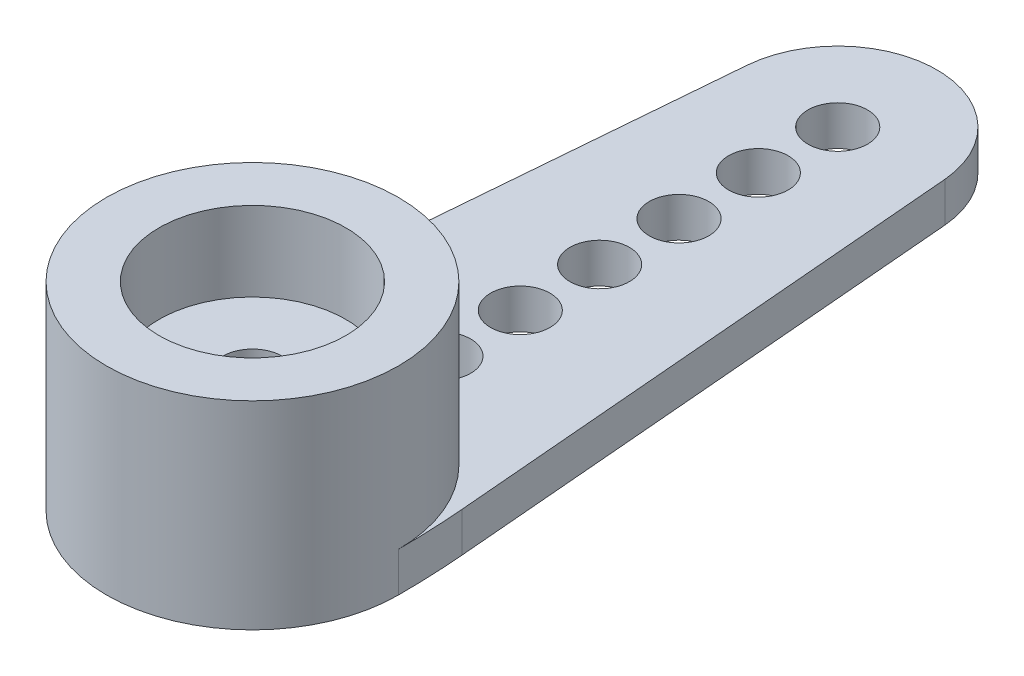
ISO-10303-21;
HEADER;
FILE_DESCRIPTION(('STEP AP214'),'2;1');
FILE_NAME('part.step','',(''),(''),'','','');
FILE_SCHEMA(('AUTOMOTIVE_DESIGN { 1 0 10303 214 1 1 1 1 }'));
ENDSEC;
DATA;
#1=APPLICATION_CONTEXT('core data for automotive mechanical design processes');
#2=APPLICATION_PROTOCOL_DEFINITION('international standard','automotive_design',2000,#1);
#3=PRODUCT_CONTEXT('',#1,'mechanical');
#4=PRODUCT('Part','Part','',(#3));
#5=PRODUCT_RELATED_PRODUCT_CATEGORY('part','',(#4));
#6=PRODUCT_DEFINITION_FORMATION('','',#4);
#7=PRODUCT_DEFINITION_CONTEXT('part definition',#1,'design');
#8=PRODUCT_DEFINITION('design','',#6,#7);
#9=PRODUCT_DEFINITION_SHAPE('','',#8);
#10=(LENGTH_UNIT() NAMED_UNIT(*) SI_UNIT(.MILLI.,.METRE.));
#11=(NAMED_UNIT(*) PLANE_ANGLE_UNIT() SI_UNIT($,.RADIAN.));
#12=(NAMED_UNIT(*) SI_UNIT($,.STERADIAN.) SOLID_ANGLE_UNIT());
#13=UNCERTAINTY_MEASURE_WITH_UNIT(LENGTH_MEASURE(1.E-05),#10,'distance_accuracy_value','');
#14=(GEOMETRIC_REPRESENTATION_CONTEXT(3) GLOBAL_UNCERTAINTY_ASSIGNED_CONTEXT((#13)) GLOBAL_UNIT_ASSIGNED_CONTEXT((#10,
#11,#12)) REPRESENTATION_CONTEXT('',''));
#15=CARTESIAN_POINT('',(0.,0.,0.));
#16=DIRECTION('',(0.,0.,1.));
#17=DIRECTION('',(1.,0.,0.));
#18=AXIS2_PLACEMENT_3D('',#15,#16,#17);
#19=CARTESIAN_POINT('',(0.,5.,0.));
#20=DIRECTION('',(0.,-1.,0.));
#21=DIRECTION('',(0.,0.,-1.));
#22=AXIS2_PLACEMENT_3D('',#19,#20,#21);
#23=CYLINDRICAL_SURFACE('',#22,0.75);
#24=CARTESIAN_POINT('',(0.,0.5,0.));
#25=DIRECTION('',(0.,-1.,0.));
#26=DIRECTION('',(0.,0.,-1.));
#27=AXIS2_PLACEMENT_3D('',#24,#25,#26);
#28=CIRCLE('',#27,0.75);
#29=CARTESIAN_POINT('',(0.,0.5,-0.75));
#30=VERTEX_POINT('',#29);
#31=EDGE_CURVE('E177',#30,#30,#28,.F.);
#32=ORIENTED_EDGE('',*,*,#31,.F.);
#33=EDGE_LOOP('',(#32));
#34=FACE_BOUND('',#33,.T.);
#35=CARTESIAN_POINT('',(0.,3.,0.));
#36=DIRECTION('',(0.,1.,0.));
#37=DIRECTION('',(0.,0.,1.));
#38=AXIS2_PLACEMENT_3D('',#35,#36,#37);
#39=CIRCLE('',#38,0.75);
#40=CARTESIAN_POINT('',(0.,3.,0.75));
#41=VERTEX_POINT('',#40);
#42=EDGE_CURVE('E42',#41,#41,#39,.T.);
#43=ORIENTED_EDGE('',*,*,#42,.T.);
#44=EDGE_LOOP('',(#43));
#45=FACE_BOUND('',#44,.T.);
#46=ADVANCED_FACE('F38',(#34,#45),#23,.F.);
#47=CARTESIAN_POINT('',(0.,1.,0.));
#48=DIRECTION('',(0.,-1.,0.));
#49=DIRECTION('',(0.,0.,-1.));
#50=AXIS2_PLACEMENT_3D('',#47,#48,#49);
#51=CYLINDRICAL_SURFACE('',#50,3.67931811974816);
#52=CARTESIAN_POINT('',(0.,0.,0.));
#53=DIRECTION('',(0.,1.,0.));
#54=DIRECTION('',(0.,0.,1.));
#55=AXIS2_PLACEMENT_3D('',#52,#53,#54);
#56=CIRCLE('',#55,3.67931811974816);
#57=CARTESIAN_POINT('',(-3.67931811974816,0.,0.));
#58=VERTEX_POINT('',#57);
#59=CARTESIAN_POINT('',(3.67931811974816,0.,0.));
#60=VERTEX_POINT('',#59);
#61=EDGE_CURVE('E143',#58,#60,#56,.T.);
#62=ORIENTED_EDGE('',*,*,#61,.T.);
#63=DIRECTION('',(0.,-1.,0.));
#64=VECTOR('',#63,1.);
#65=CARTESIAN_POINT('',(3.67931811974816,1.,0.));
#66=LINE('',#65,#64);
#67=CARTESIAN_POINT('',(3.67931811974816,1.,0.));
#68=VERTEX_POINT('',#67);
#69=EDGE_CURVE('E11',#68,#60,#66,.T.);
#70=ORIENTED_EDGE('',*,*,#69,.F.);
#71=CARTESIAN_POINT('',(0.,1.,0.));
#72=DIRECTION('',(0.,1.,0.));
#73=DIRECTION('',(0.,0.,1.));
#74=AXIS2_PLACEMENT_3D('',#71,#72,#73);
#75=CIRCLE('',#74,3.67931811974816);
#76=CARTESIAN_POINT('',(-3.67931811974816,1.,0.));
#77=VERTEX_POINT('',#76);
#78=EDGE_CURVE('E147',#68,#77,#75,.T.);
#79=ORIENTED_EDGE('',*,*,#78,.T.);
#80=DIRECTION('',(0.,-1.,0.));
#81=VECTOR('',#80,1.);
#82=CARTESIAN_POINT('',(-3.67931811974816,1.,0.));
#83=LINE('',#82,#81);
#84=EDGE_CURVE('E142',#77,#58,#83,.T.);
#85=ORIENTED_EDGE('',*,*,#84,.T.);
#86=EDGE_LOOP('',(#62,#70,#79,#85));
#87=FACE_BOUND('',#86,.T.);
#88=CARTESIAN_POINT('',(0.,5.,0.));
#89=DIRECTION('',(0.,-1.,0.));
#90=DIRECTION('',(0.,0.,-1.));
#91=AXIS2_PLACEMENT_3D('',#88,#89,#90);
#92=CIRCLE('',#91,3.67931811974816);
#93=CARTESIAN_POINT('',(0.,5.,-3.67931811974816));
#94=VERTEX_POINT('',#93);
#95=EDGE_CURVE('E198',#94,#94,#92,.T.);
#96=ORIENTED_EDGE('',*,*,#95,.T.);
#97=EDGE_LOOP('',(#96));
#98=FACE_BOUND('',#97,.T.);
#99=ADVANCED_FACE('F40',(#87,#98),#51,.T.);
#100=CARTESIAN_POINT('',(-16.3206818802518,1.,0.));
#101=DIRECTION('',(0.,-1.,0.));
#102=DIRECTION('',(0.,0.,-1.));
#103=AXIS2_PLACEMENT_3D('',#100,#101,#102);
#104=CYLINDRICAL_SURFACE('',#103,20.);
#105=CARTESIAN_POINT('',(-16.3206818802518,0.,0.));
#106=DIRECTION('',(0.,1.,0.));
#107=DIRECTION('',(0.,0.,1.));
#108=AXIS2_PLACEMENT_3D('',#105,#106,#107);
#109=CIRCLE('',#108,20.);
#110=CARTESIAN_POINT('',(3.60888515621104,0.,-1.67700856859233));
#111=VERTEX_POINT('',#110);
#112=EDGE_CURVE('E146',#60,#111,#109,.T.);
#113=ORIENTED_EDGE('',*,*,#112,.T.);
#114=DIRECTION('',(0.,-1.,0.));
#115=VECTOR('',#114,1.);
#116=CARTESIAN_POINT('',(3.60888515621104,1.,-1.67700856859233));
#117=LINE('',#116,#115);
#118=CARTESIAN_POINT('',(3.60888515621104,1.,-1.67700856859233));
#119=VERTEX_POINT('',#118);
#120=EDGE_CURVE('E48',#119,#111,#117,.T.);
#121=ORIENTED_EDGE('',*,*,#120,.F.);
#122=CARTESIAN_POINT('',(-16.3206818802518,1.,0.));
#123=DIRECTION('',(0.,1.,0.));
#124=DIRECTION('',(0.,0.,1.));
#125=AXIS2_PLACEMENT_3D('',#122,#123,#124);
#126=CIRCLE('',#125,20.);
#127=EDGE_CURVE('E93',#68,#119,#126,.T.);
#128=ORIENTED_EDGE('',*,*,#127,.F.);
#129=ORIENTED_EDGE('',*,*,#69,.T.);
#130=EDGE_LOOP('',(#113,#121,#128,#129));
#131=FACE_BOUND('',#130,.T.);
#132=ADVANCED_FACE('F208',(#131),#104,.T.);
#133=CARTESIAN_POINT('',(3.72363414619564,1.,-0.31333176270452));
#134=DIRECTION('',(0.996478351823144,0.,-0.083850428429613));
#135=DIRECTION('',(-0.083850428429613,0.,-0.996478351823144));
#136=AXIS2_PLACEMENT_3D('',#133,#134,#135);
#137=PLANE('',#136);
#138=DIRECTION('',(0.083850428429613,0.,0.996478351823144));
#139=VECTOR('',#138,1.);
#140=CARTESIAN_POINT('',(3.72363414619564,0.,-0.31333176270452));
#141=LINE('',#140,#139);
#142=CARTESIAN_POINT('',(2.49119587955786,0.,-14.959626071074));
#143=VERTEX_POINT('',#142);
#144=EDGE_CURVE('E150',#143,#111,#141,.T.);
#145=ORIENTED_EDGE('',*,*,#144,.F.);
#146=DIRECTION('',(0.,-1.,0.));
#147=VECTOR('',#146,1.);
#148=CARTESIAN_POINT('',(2.49119587955786,1.,-14.959626071074));
#149=LINE('',#148,#147);
#150=CARTESIAN_POINT('',(2.49119587955786,1.,-14.959626071074));
#151=VERTEX_POINT('',#150);
#152=EDGE_CURVE('E109',#151,#143,#149,.T.);
#153=ORIENTED_EDGE('',*,*,#152,.F.);
#154=DIRECTION('',(0.083850428429613,0.,0.996478351823144));
#155=VECTOR('',#154,1.);
#156=CARTESIAN_POINT('',(3.72363414619564,1.,-0.31333176270452));
#157=LINE('',#156,#155);
#158=EDGE_CURVE('E118',#151,#119,#157,.T.);
#159=ORIENTED_EDGE('',*,*,#158,.T.);
#160=ORIENTED_EDGE('',*,*,#120,.T.);
#161=EDGE_LOOP('',(#145,#153,#159,#160));
#162=FACE_BOUND('',#161,.T.);
#163=ADVANCED_FACE('F211',(#162),#137,.T.);
#164=CARTESIAN_POINT('',(0.,1.,-14.75));
#165=DIRECTION('',(0.,-1.,0.));
#166=DIRECTION('',(0.,0.,-1.));
#167=AXIS2_PLACEMENT_3D('',#164,#165,#166);
#168=CYLINDRICAL_SURFACE('',#167,2.5);
#169=CARTESIAN_POINT('',(0.,0.,-14.75));
#170=DIRECTION('',(0.,1.,0.));
#171=DIRECTION('',(0.,0.,1.));
#172=AXIS2_PLACEMENT_3D('',#169,#170,#171);
#173=CIRCLE('',#172,2.5);
#174=CARTESIAN_POINT('',(-2.49119587955786,0.,-14.959626071074));
#175=VERTEX_POINT('',#174);
#176=EDGE_CURVE('E108',#175,#143,#173,.F.);
#177=ORIENTED_EDGE('',*,*,#176,.F.);
#178=DIRECTION('',(0.,-1.,0.));
#179=VECTOR('',#178,1.);
#180=CARTESIAN_POINT('',(-2.49119587955786,1.,-14.959626071074));
#181=LINE('',#180,#179);
#182=CARTESIAN_POINT('',(-2.49119587955786,1.,-14.959626071074));
#183=VERTEX_POINT('',#182);
#184=EDGE_CURVE('E102',#183,#175,#181,.T.);
#185=ORIENTED_EDGE('',*,*,#184,.F.);
#186=CARTESIAN_POINT('',(0.,1.,-14.75));
#187=DIRECTION('',(0.,1.,0.));
#188=DIRECTION('',(0.,0.,1.));
#189=AXIS2_PLACEMENT_3D('',#186,#187,#188);
#190=CIRCLE('',#189,2.5);
#191=EDGE_CURVE('E106',#183,#151,#190,.F.);
#192=ORIENTED_EDGE('',*,*,#191,.T.);
#193=ORIENTED_EDGE('',*,*,#152,.T.);
#194=EDGE_LOOP('',(#177,#185,#192,#193));
#195=FACE_BOUND('',#194,.T.);
#196=ADVANCED_FACE('F104',(#195),#168,.T.);
#197=CARTESIAN_POINT('',(-3.72363414619564,1.,-0.31333176270452));
#198=DIRECTION('',(0.996478351823144,0.,0.083850428429613));
#199=DIRECTION('',(0.083850428429613,0.,-0.996478351823144));
#200=AXIS2_PLACEMENT_3D('',#197,#198,#199);
#201=PLANE('',#200);
#202=DIRECTION('',(-0.083850428429613,0.,0.996478351823144));
#203=VECTOR('',#202,1.);
#204=CARTESIAN_POINT('',(-3.72363414619564,0.,-0.31333176270452));
#205=LINE('',#204,#203);
#206=CARTESIAN_POINT('',(-3.60888515621104,0.,-1.67700856859233));
#207=VERTEX_POINT('',#206);
#208=EDGE_CURVE('E80',#175,#207,#205,.T.);
#209=ORIENTED_EDGE('',*,*,#208,.T.);
#210=DIRECTION('',(0.,-1.,0.));
#211=VECTOR('',#210,1.);
#212=CARTESIAN_POINT('',(-3.60888515621104,1.,-1.67700856859233));
#213=LINE('',#212,#211);
#214=CARTESIAN_POINT('',(-3.60888515621104,1.,-1.67700856859233));
#215=VERTEX_POINT('',#214);
#216=EDGE_CURVE('E110',#215,#207,#213,.T.);
#217=ORIENTED_EDGE('',*,*,#216,.F.);
#218=DIRECTION('',(-0.083850428429613,0.,0.996478351823144));
#219=VECTOR('',#218,1.);
#220=CARTESIAN_POINT('',(-3.72363414619564,1.,-0.31333176270452));
#221=LINE('',#220,#219);
#222=EDGE_CURVE('E112',#183,#215,#221,.T.);
#223=ORIENTED_EDGE('',*,*,#222,.F.);
#224=ORIENTED_EDGE('',*,*,#184,.T.);
#225=EDGE_LOOP('',(#209,#217,#223,#224));
#226=FACE_BOUND('',#225,.T.);
#227=ADVANCED_FACE('F113',(#226),#201,.F.);
#228=CARTESIAN_POINT('',(0.,1.,-12.75));
#229=DIRECTION('',(0.,-1.,0.));
#230=DIRECTION('',(0.,0.,-1.));
#231=AXIS2_PLACEMENT_3D('',#228,#229,#230);
#232=CYLINDRICAL_SURFACE('',#231,0.750000000000019);
#233=CARTESIAN_POINT('',(0.,1.,-12.75));
#234=DIRECTION('',(0.,1.,0.));
#235=DIRECTION('',(0.,0.,1.));
#236=AXIS2_PLACEMENT_3D('',#233,#234,#235);
#237=CIRCLE('',#236,0.750000000000019);
#238=CARTESIAN_POINT('',(0.,1.,-12.));
#239=VERTEX_POINT('',#238);
#240=EDGE_CURVE('E136',#239,#239,#237,.T.);
#241=ORIENTED_EDGE('',*,*,#240,.T.);
#242=EDGE_LOOP('',(#241));
#243=FACE_BOUND('',#242,.T.);
#244=CARTESIAN_POINT('',(0.,0.,-12.75));
#245=DIRECTION('',(0.,1.,0.));
#246=DIRECTION('',(0.,0.,1.));
#247=AXIS2_PLACEMENT_3D('',#244,#245,#246);
#248=CIRCLE('',#247,0.750000000000019);
#249=CARTESIAN_POINT('',(0.,0.,-12.));
#250=VERTEX_POINT('',#249);
#251=EDGE_CURVE('E168',#250,#250,#248,.T.);
#252=ORIENTED_EDGE('',*,*,#251,.F.);
#253=EDGE_LOOP('',(#252));
#254=FACE_BOUND('',#253,.T.);
#255=ADVANCED_FACE('F374',(#243,#254),#232,.F.);
#256=CARTESIAN_POINT('',(0.,1.,-10.75));
#257=DIRECTION('',(0.,-1.,0.));
#258=DIRECTION('',(0.,0.,-1.));
#259=AXIS2_PLACEMENT_3D('',#256,#257,#258);
#260=CYLINDRICAL_SURFACE('',#259,0.75);
#261=CARTESIAN_POINT('',(0.,1.,-10.75));
#262=DIRECTION('',(0.,1.,0.));
#263=DIRECTION('',(0.,0.,1.));
#264=AXIS2_PLACEMENT_3D('',#261,#262,#263);
#265=CIRCLE('',#264,0.75);
#266=CARTESIAN_POINT('',(0.,1.,-10.));
#267=VERTEX_POINT('',#266);
#268=EDGE_CURVE('E133',#267,#267,#265,.T.);
#269=ORIENTED_EDGE('',*,*,#268,.T.);
#270=EDGE_LOOP('',(#269));
#271=FACE_BOUND('',#270,.T.);
#272=CARTESIAN_POINT('',(0.,0.,-10.75));
#273=DIRECTION('',(0.,1.,0.));
#274=DIRECTION('',(0.,0.,1.));
#275=AXIS2_PLACEMENT_3D('',#272,#273,#274);
#276=CIRCLE('',#275,0.75);
#277=CARTESIAN_POINT('',(0.,0.,-10.));
#278=VERTEX_POINT('',#277);
#279=EDGE_CURVE('E165',#278,#278,#276,.T.);
#280=ORIENTED_EDGE('',*,*,#279,.F.);
#281=EDGE_LOOP('',(#280));
#282=FACE_BOUND('',#281,.T.);
#283=ADVANCED_FACE('F364',(#271,#282),#260,.F.);
#284=CARTESIAN_POINT('',(0.,1.,-8.75));
#285=DIRECTION('',(0.,-1.,0.));
#286=DIRECTION('',(0.,0.,-1.));
#287=AXIS2_PLACEMENT_3D('',#284,#285,#286);
#288=CYLINDRICAL_SURFACE('',#287,0.75);
#289=CARTESIAN_POINT('',(0.,1.,-8.75));
#290=DIRECTION('',(0.,1.,0.));
#291=DIRECTION('',(0.,0.,1.));
#292=AXIS2_PLACEMENT_3D('',#289,#290,#291);
#293=CIRCLE('',#292,0.75);
#294=CARTESIAN_POINT('',(0.,1.,-8.));
#295=VERTEX_POINT('',#294);
#296=EDGE_CURVE('E130',#295,#295,#293,.T.);
#297=ORIENTED_EDGE('',*,*,#296,.T.);
#298=EDGE_LOOP('',(#297));
#299=FACE_BOUND('',#298,.T.);
#300=CARTESIAN_POINT('',(0.,0.,-8.75));
#301=DIRECTION('',(0.,1.,0.));
#302=DIRECTION('',(0.,0.,1.));
#303=AXIS2_PLACEMENT_3D('',#300,#301,#302);
#304=CIRCLE('',#303,0.75);
#305=CARTESIAN_POINT('',(0.,0.,-8.));
#306=VERTEX_POINT('',#305);
#307=EDGE_CURVE('E162',#306,#306,#304,.T.);
#308=ORIENTED_EDGE('',*,*,#307,.F.);
#309=EDGE_LOOP('',(#308));
#310=FACE_BOUND('',#309,.T.);
#311=ADVANCED_FACE('F354',(#299,#310),#288,.F.);
#312=CARTESIAN_POINT('',(0.,1.,-6.75));
#313=DIRECTION('',(0.,-1.,0.));
#314=DIRECTION('',(0.,0.,-1.));
#315=AXIS2_PLACEMENT_3D('',#312,#313,#314);
#316=CYLINDRICAL_SURFACE('',#315,0.75);
#317=CARTESIAN_POINT('',(0.,1.,-6.75));
#318=DIRECTION('',(0.,1.,0.));
#319=DIRECTION('',(0.,0.,1.));
#320=AXIS2_PLACEMENT_3D('',#317,#318,#319);
#321=CIRCLE('',#320,0.75);
#322=CARTESIAN_POINT('',(0.,1.,-6.));
#323=VERTEX_POINT('',#322);
#324=EDGE_CURVE('E127',#323,#323,#321,.T.);
#325=ORIENTED_EDGE('',*,*,#324,.T.);
#326=EDGE_LOOP('',(#325));
#327=FACE_BOUND('',#326,.T.);
#328=CARTESIAN_POINT('',(0.,0.,-6.75));
#329=DIRECTION('',(0.,1.,0.));
#330=DIRECTION('',(0.,0.,1.));
#331=AXIS2_PLACEMENT_3D('',#328,#329,#330);
#332=CIRCLE('',#331,0.75);
#333=CARTESIAN_POINT('',(0.,0.,-6.));
#334=VERTEX_POINT('',#333);
#335=EDGE_CURVE('E159',#334,#334,#332,.T.);
#336=ORIENTED_EDGE('',*,*,#335,.F.);
#337=EDGE_LOOP('',(#336));
#338=FACE_BOUND('',#337,.T.);
#339=ADVANCED_FACE('F344',(#327,#338),#316,.F.);
#340=CARTESIAN_POINT('',(1.04744440165294E-13,1.,-4.75));
#341=DIRECTION('',(0.,-1.,0.));
#342=DIRECTION('',(0.,0.,-1.));
#343=AXIS2_PLACEMENT_3D('',#340,#341,#342);
#344=CYLINDRICAL_SURFACE('',#343,0.75);
#345=CARTESIAN_POINT('',(1.04744440165294E-13,1.,-4.75));
#346=DIRECTION('',(0.,1.,0.));
#347=DIRECTION('',(0.,0.,1.));
#348=AXIS2_PLACEMENT_3D('',#345,#346,#347);
#349=CIRCLE('',#348,0.75);
#350=CARTESIAN_POINT('',(1.04744440165294E-13,1.,-4.));
#351=VERTEX_POINT('',#350);
#352=EDGE_CURVE('E124',#351,#351,#349,.T.);
#353=ORIENTED_EDGE('',*,*,#352,.T.);
#354=EDGE_LOOP('',(#353));
#355=FACE_BOUND('',#354,.T.);
#356=CARTESIAN_POINT('',(1.04744440165294E-13,0.,-4.75));
#357=DIRECTION('',(0.,1.,0.));
#358=DIRECTION('',(0.,0.,1.));
#359=AXIS2_PLACEMENT_3D('',#356,#357,#358);
#360=CIRCLE('',#359,0.75);
#361=CARTESIAN_POINT('',(1.04744440165294E-13,0.,-4.));
#362=VERTEX_POINT('',#361);
#363=EDGE_CURVE('E156',#362,#362,#360,.T.);
#364=ORIENTED_EDGE('',*,*,#363,.F.);
#365=EDGE_LOOP('',(#364));
#366=FACE_BOUND('',#365,.T.);
#367=ADVANCED_FACE('F241',(#355,#366),#344,.F.);
#368=CARTESIAN_POINT('',(16.3206818802518,1.,0.));
#369=DIRECTION('',(0.,-1.,0.));
#370=DIRECTION('',(0.,0.,-1.));
#371=AXIS2_PLACEMENT_3D('',#368,#369,#370);
#372=CYLINDRICAL_SURFACE('',#371,20.);
#373=CARTESIAN_POINT('',(16.3206818802518,0.,0.));
#374=DIRECTION('',(0.,1.,0.));
#375=DIRECTION('',(0.,0.,1.));
#376=AXIS2_PLACEMENT_3D('',#373,#374,#375);
#377=CIRCLE('',#376,20.);
#378=EDGE_CURVE('E86',#207,#58,#377,.T.);
#379=ORIENTED_EDGE('',*,*,#378,.T.);
#380=ORIENTED_EDGE('',*,*,#84,.F.);
#381=CARTESIAN_POINT('',(16.3206818802518,1.,0.));
#382=DIRECTION('',(0.,1.,0.));
#383=DIRECTION('',(0.,0.,1.));
#384=AXIS2_PLACEMENT_3D('',#381,#382,#383);
#385=CIRCLE('',#384,20.);
#386=EDGE_CURVE('E57',#215,#77,#385,.T.);
#387=ORIENTED_EDGE('',*,*,#386,.F.);
#388=ORIENTED_EDGE('',*,*,#216,.T.);
#389=EDGE_LOOP('',(#379,#380,#387,#388));
#390=FACE_BOUND('',#389,.T.);
#391=ADVANCED_FACE('F233',(#390),#372,.T.);
#392=CARTESIAN_POINT('',(0.,1.,-14.75));
#393=DIRECTION('',(0.,-1.,0.));
#394=DIRECTION('',(0.,0.,-1.));
#395=AXIS2_PLACEMENT_3D('',#392,#393,#394);
#396=CYLINDRICAL_SURFACE('',#395,0.75);
#397=CARTESIAN_POINT('',(0.,1.,-14.75));
#398=DIRECTION('',(0.,1.,0.));
#399=DIRECTION('',(0.,0.,1.));
#400=AXIS2_PLACEMENT_3D('',#397,#398,#399);
#401=CIRCLE('',#400,0.75);
#402=CARTESIAN_POINT('',(0.,1.,-14.));
#403=VERTEX_POINT('',#402);
#404=EDGE_CURVE('E139',#403,#403,#401,.T.);
#405=ORIENTED_EDGE('',*,*,#404,.T.);
#406=EDGE_LOOP('',(#405));
#407=FACE_BOUND('',#406,.T.);
#408=CARTESIAN_POINT('',(0.,0.,-14.75));
#409=DIRECTION('',(0.,1.,0.));
#410=DIRECTION('',(0.,0.,1.));
#411=AXIS2_PLACEMENT_3D('',#408,#409,#410);
#412=CIRCLE('',#411,0.75);
#413=CARTESIAN_POINT('',(0.,0.,-14.));
#414=VERTEX_POINT('',#413);
#415=EDGE_CURVE('E171',#414,#414,#412,.T.);
#416=ORIENTED_EDGE('',*,*,#415,.F.);
#417=EDGE_LOOP('',(#416));
#418=FACE_BOUND('',#417,.T.);
#419=ADVANCED_FACE('F231',(#407,#418),#396,.F.);
#420=CARTESIAN_POINT('',(0.,1.,0.));
#421=DIRECTION('',(0.,1.,0.));
#422=DIRECTION('',(0.,0.,1.));
#423=AXIS2_PLACEMENT_3D('',#420,#421,#422);
#424=PLANE('',#423);
#425=ORIENTED_EDGE('',*,*,#78,.F.);
#426=ORIENTED_EDGE('',*,*,#127,.T.);
#427=ORIENTED_EDGE('',*,*,#158,.F.);
#428=ORIENTED_EDGE('',*,*,#191,.F.);
#429=ORIENTED_EDGE('',*,*,#222,.T.);
#430=ORIENTED_EDGE('',*,*,#386,.T.);
#431=EDGE_LOOP('',(#425,#426,#427,#428,#429,#430));
#432=FACE_BOUND('',#431,.T.);
#433=ORIENTED_EDGE('',*,*,#352,.F.);
#434=EDGE_LOOP('',(#433));
#435=FACE_BOUND('',#434,.T.);
#436=ORIENTED_EDGE('',*,*,#324,.F.);
#437=EDGE_LOOP('',(#436));
#438=FACE_BOUND('',#437,.T.);
#439=ORIENTED_EDGE('',*,*,#296,.F.);
#440=EDGE_LOOP('',(#439));
#441=FACE_BOUND('',#440,.T.);
#442=ORIENTED_EDGE('',*,*,#268,.F.);
#443=EDGE_LOOP('',(#442));
#444=FACE_BOUND('',#443,.T.);
#445=ORIENTED_EDGE('',*,*,#240,.F.);
#446=EDGE_LOOP('',(#445));
#447=FACE_BOUND('',#446,.T.);
#448=ORIENTED_EDGE('',*,*,#404,.F.);
#449=EDGE_LOOP('',(#448));
#450=FACE_BOUND('',#449,.T.);
#451=ADVANCED_FACE('F115',(#432,#435,#438,#441,#444,#447,#450),#424,.T.);
#452=CARTESIAN_POINT('',(0.,0.,0.));
#453=DIRECTION('',(0.,1.,0.));
#454=DIRECTION('',(0.,0.,1.));
#455=AXIS2_PLACEMENT_3D('',#452,#453,#454);
#456=PLANE('',#455);
#457=CARTESIAN_POINT('',(0.,0.,0.));
#458=DIRECTION('',(0.,-1.,0.));
#459=DIRECTION('',(0.,0.,-1.));
#460=AXIS2_PLACEMENT_3D('',#457,#458,#459);
#461=CIRCLE('',#460,1.5);
#462=CARTESIAN_POINT('',(0.,0.,-1.5));
#463=VERTEX_POINT('',#462);
#464=EDGE_CURVE('E179',#463,#463,#461,.T.);
#465=ORIENTED_EDGE('',*,*,#464,.F.);
#466=EDGE_LOOP('',(#465));
#467=FACE_BOUND('',#466,.T.);
#468=ORIENTED_EDGE('',*,*,#112,.F.);
#469=ORIENTED_EDGE('',*,*,#61,.F.);
#470=ORIENTED_EDGE('',*,*,#378,.F.);
#471=ORIENTED_EDGE('',*,*,#208,.F.);
#472=ORIENTED_EDGE('',*,*,#176,.T.);
#473=ORIENTED_EDGE('',*,*,#144,.T.);
#474=EDGE_LOOP('',(#468,#469,#470,#471,#472,#473));
#475=FACE_BOUND('',#474,.T.);
#476=ORIENTED_EDGE('',*,*,#363,.T.);
#477=EDGE_LOOP('',(#476));
#478=FACE_BOUND('',#477,.T.);
#479=ORIENTED_EDGE('',*,*,#335,.T.);
#480=EDGE_LOOP('',(#479));
#481=FACE_BOUND('',#480,.T.);
#482=ORIENTED_EDGE('',*,*,#307,.T.);
#483=EDGE_LOOP('',(#482));
#484=FACE_BOUND('',#483,.T.);
#485=ORIENTED_EDGE('',*,*,#279,.T.);
#486=EDGE_LOOP('',(#485));
#487=FACE_BOUND('',#486,.T.);
#488=ORIENTED_EDGE('',*,*,#251,.T.);
#489=EDGE_LOOP('',(#488));
#490=FACE_BOUND('',#489,.T.);
#491=ORIENTED_EDGE('',*,*,#415,.T.);
#492=EDGE_LOOP('',(#491));
#493=FACE_BOUND('',#492,.T.);
#494=ADVANCED_FACE('F213',(#467,#475,#478,#481,#484,#487,#490,#493),#456,.F.);
#495=CARTESIAN_POINT('',(0.,5.,0.));
#496=DIRECTION('',(0.,-1.,0.));
#497=DIRECTION('',(0.,0.,-1.));
#498=AXIS2_PLACEMENT_3D('',#495,#496,#497);
#499=PLANE('',#498);
#500=CARTESIAN_POINT('',(0.,5.,0.));
#501=DIRECTION('',(0.,1.,0.));
#502=DIRECTION('',(0.,0.,1.));
#503=AXIS2_PLACEMENT_3D('',#500,#501,#502);
#504=CIRCLE('',#503,2.355);
#505=CARTESIAN_POINT('',(0.,5.,2.355));
#506=VERTEX_POINT('',#505);
#507=EDGE_CURVE('E190',#506,#506,#504,.T.);
#508=ORIENTED_EDGE('',*,*,#507,.F.);
#509=EDGE_LOOP('',(#508));
#510=FACE_BOUND('',#509,.T.);
#511=ORIENTED_EDGE('',*,*,#95,.F.);
#512=EDGE_LOOP('',(#511));
#513=FACE_BOUND('',#512,.T.);
#514=ADVANCED_FACE('F216',(#510,#513),#499,.F.);
#515=CARTESIAN_POINT('',(0.,0.5,0.));
#516=DIRECTION('',(0.,-1.,0.));
#517=DIRECTION('',(0.,0.,-1.));
#518=AXIS2_PLACEMENT_3D('',#515,#516,#517);
#519=CYLINDRICAL_SURFACE('',#518,1.5);
#520=CARTESIAN_POINT('',(0.,0.5,0.));
#521=DIRECTION('',(0.,-1.,0.));
#522=DIRECTION('',(0.,0.,-1.));
#523=AXIS2_PLACEMENT_3D('',#520,#521,#522);
#524=CIRCLE('',#523,1.5);
#525=CARTESIAN_POINT('',(0.,0.5,-1.5));
#526=VERTEX_POINT('',#525);
#527=EDGE_CURVE('E183',#526,#526,#524,.T.);
#528=ORIENTED_EDGE('',*,*,#527,.F.);
#529=EDGE_LOOP('',(#528));
#530=FACE_BOUND('',#529,.T.);
#531=ORIENTED_EDGE('',*,*,#464,.T.);
#532=EDGE_LOOP('',(#531));
#533=FACE_BOUND('',#532,.T.);
#534=ADVANCED_FACE('F257',(#530,#533),#519,.F.);
#535=CARTESIAN_POINT('',(0.,0.5,0.));
#536=DIRECTION('',(0.,-1.,0.));
#537=DIRECTION('',(0.,0.,-1.));
#538=AXIS2_PLACEMENT_3D('',#535,#536,#537);
#539=PLANE('',#538);
#540=ORIENTED_EDGE('',*,*,#31,.T.);
#541=EDGE_LOOP('',(#540));
#542=FACE_BOUND('',#541,.T.);
#543=ORIENTED_EDGE('',*,*,#527,.T.);
#544=EDGE_LOOP('',(#543));
#545=FACE_BOUND('',#544,.T.);
#546=ADVANCED_FACE('F254',(#542,#545),#539,.T.);
#547=CARTESIAN_POINT('',(0.,3.,0.));
#548=DIRECTION('',(0.,1.,0.));
#549=DIRECTION('',(0.,0.,1.));
#550=AXIS2_PLACEMENT_3D('',#547,#548,#549);
#551=CYLINDRICAL_SURFACE('',#550,2.355);
#552=CARTESIAN_POINT('',(0.,3.,0.));
#553=DIRECTION('',(0.,1.,0.));
#554=DIRECTION('',(0.,0.,1.));
#555=AXIS2_PLACEMENT_3D('',#552,#553,#554);
#556=CIRCLE('',#555,2.355);
#557=CARTESIAN_POINT('',(0.,3.,2.355));
#558=VERTEX_POINT('',#557);
#559=EDGE_CURVE('E186',#558,#558,#556,.T.);
#560=ORIENTED_EDGE('',*,*,#559,.F.);
#561=EDGE_LOOP('',(#560));
#562=FACE_BOUND('',#561,.T.);
#563=ORIENTED_EDGE('',*,*,#507,.T.);
#564=EDGE_LOOP('',(#563));
#565=FACE_BOUND('',#564,.T.);
#566=ADVANCED_FACE('F252',(#562,#565),#551,.F.);
#567=CARTESIAN_POINT('',(0.,3.,0.));
#568=DIRECTION('',(0.,1.,0.));
#569=DIRECTION('',(0.,0.,1.));
#570=AXIS2_PLACEMENT_3D('',#567,#568,#569);
#571=PLANE('',#570);
#572=ORIENTED_EDGE('',*,*,#42,.F.);
#573=EDGE_LOOP('',(#572));
#574=FACE_BOUND('',#573,.T.);
#575=ORIENTED_EDGE('',*,*,#559,.T.);
#576=EDGE_LOOP('',(#575));
#577=FACE_BOUND('',#576,.T.);
#578=ADVANCED_FACE('F270',(#574,#577),#571,.T.);
#579=CLOSED_SHELL('',(#46,#99,#132,#163,#196,#227,#255,#283,#311,#339,#367,#391,#419,#451,#494,
#514,#534,#546,#566,#578));
#580=MANIFOLD_SOLID_BREP('B2',#579);
#581=ADVANCED_BREP_SHAPE_REPRESENTATION('',(#18,#580),#14);
#582=SHAPE_DEFINITION_REPRESENTATION(#9,#581);
ENDSEC;
END-ISO-10303-21;
